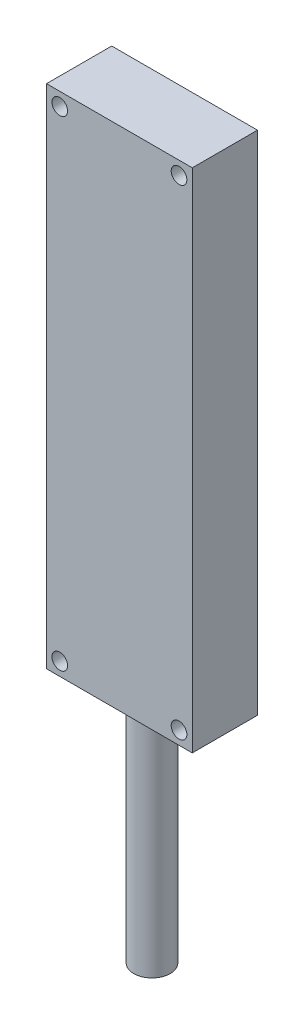
ISO-10303-21;
HEADER;
FILE_DESCRIPTION(('STEP AP214'),'2;1');
FILE_NAME('part.step','',(''),(''),'','','');
FILE_SCHEMA(('AUTOMOTIVE_DESIGN { 1 0 10303 214 1 1 1 1 }'));
ENDSEC;
DATA;
#1=APPLICATION_CONTEXT('core data for automotive mechanical design processes');
#2=APPLICATION_PROTOCOL_DEFINITION('international standard','automotive_design',2000,#1);
#3=PRODUCT_CONTEXT('',#1,'mechanical');
#4=PRODUCT('Part','Part','',(#3));
#5=PRODUCT_RELATED_PRODUCT_CATEGORY('part','',(#4));
#6=PRODUCT_DEFINITION_FORMATION('','',#4);
#7=PRODUCT_DEFINITION_CONTEXT('part definition',#1,'design');
#8=PRODUCT_DEFINITION('design','',#6,#7);
#9=PRODUCT_DEFINITION_SHAPE('','',#8);
#10=(LENGTH_UNIT() NAMED_UNIT(*) SI_UNIT(.MILLI.,.METRE.));
#11=(NAMED_UNIT(*) PLANE_ANGLE_UNIT() SI_UNIT($,.RADIAN.));
#12=(NAMED_UNIT(*) SI_UNIT($,.STERADIAN.) SOLID_ANGLE_UNIT());
#13=UNCERTAINTY_MEASURE_WITH_UNIT(LENGTH_MEASURE(1.E-05),#10,'distance_accuracy_value','');
#14=(GEOMETRIC_REPRESENTATION_CONTEXT(3) GLOBAL_UNCERTAINTY_ASSIGNED_CONTEXT((#13)) GLOBAL_UNIT_ASSIGNED_CONTEXT((#10,
#11,#12)) REPRESENTATION_CONTEXT('',''));
#15=CARTESIAN_POINT('',(0.,0.,0.));
#16=DIRECTION('',(0.,0.,1.));
#17=DIRECTION('',(1.,0.,0.));
#18=AXIS2_PLACEMENT_3D('',#15,#16,#17);
#19=CARTESIAN_POINT('',(-13.97,-48.57,12.5));
#20=DIRECTION('',(1.,0.,0.));
#21=DIRECTION('',(0.,0.,-1.));
#22=AXIS2_PLACEMENT_3D('',#19,#20,#21);
#23=PLANE('',#22);
#24=DIRECTION('',(0.,-1.,0.));
#25=VECTOR('',#24,1.);
#26=CARTESIAN_POINT('',(-13.97,-48.57,0.));
#27=LINE('',#26,#25);
#28=CARTESIAN_POINT('',(-13.97,48.57,0.));
#29=VERTEX_POINT('',#28);
#30=CARTESIAN_POINT('',(-13.97,-48.57,0.));
#31=VERTEX_POINT('',#30);
#32=EDGE_CURVE('E110',#29,#31,#27,.T.);
#33=ORIENTED_EDGE('',*,*,#32,.T.);
#34=DIRECTION('',(0.,0.,-1.));
#35=VECTOR('',#34,1.);
#36=CARTESIAN_POINT('',(-13.97,-48.57,12.5));
#37=LINE('',#36,#35);
#38=CARTESIAN_POINT('',(-13.97,-48.57,12.5));
#39=VERTEX_POINT('',#38);
#40=EDGE_CURVE('E42',#39,#31,#37,.T.);
#41=ORIENTED_EDGE('',*,*,#40,.F.);
#42=DIRECTION('',(0.,-1.,0.));
#43=VECTOR('',#42,1.);
#44=CARTESIAN_POINT('',(-13.97,-48.57,12.5));
#45=LINE('',#44,#43);
#46=CARTESIAN_POINT('',(-13.97,48.57,12.5));
#47=VERTEX_POINT('',#46);
#48=EDGE_CURVE('E93',#47,#39,#45,.T.);
#49=ORIENTED_EDGE('',*,*,#48,.F.);
#50=DIRECTION('',(0.,0.,-1.));
#51=VECTOR('',#50,1.);
#52=CARTESIAN_POINT('',(-13.97,48.57,12.5));
#53=LINE('',#52,#51);
#54=EDGE_CURVE('E106',#47,#29,#53,.T.);
#55=ORIENTED_EDGE('',*,*,#54,.T.);
#56=EDGE_LOOP('',(#33,#41,#49,#55));
#57=FACE_BOUND('',#56,.T.);
#58=ADVANCED_FACE('F39',(#57),#23,.F.);
#59=CARTESIAN_POINT('',(13.97,-48.57,12.5));
#60=DIRECTION('',(0.,1.,0.));
#61=DIRECTION('',(0.,0.,1.));
#62=AXIS2_PLACEMENT_3D('',#59,#60,#61);
#63=PLANE('',#62);
#64=CARTESIAN_POINT('',(0.,-48.57,6.25));
#65=DIRECTION('',(0.,-1.,0.));
#66=DIRECTION('',(0.,0.,-1.));
#67=AXIS2_PLACEMENT_3D('',#64,#65,#66);
#68=CIRCLE('',#67,3.5);
#69=CARTESIAN_POINT('',(0.,-48.57,9.75));
#70=VERTEX_POINT('',#69);
#71=EDGE_CURVE('E11',#70,#70,#68,.T.);
#72=ORIENTED_EDGE('',*,*,#71,.F.);
#73=EDGE_LOOP('',(#72));
#74=FACE_BOUND('',#73,.T.);
#75=DIRECTION('',(1.,0.,0.));
#76=VECTOR('',#75,1.);
#77=CARTESIAN_POINT('',(13.97,-48.57,0.));
#78=LINE('',#77,#76);
#79=CARTESIAN_POINT('',(13.97,-48.57,0.));
#80=VERTEX_POINT('',#79);
#81=EDGE_CURVE('E99',#31,#80,#78,.T.);
#82=ORIENTED_EDGE('',*,*,#81,.T.);
#83=DIRECTION('',(0.,0.,-1.));
#84=VECTOR('',#83,1.);
#85=CARTESIAN_POINT('',(13.97,-48.57,12.5));
#86=LINE('',#85,#84);
#87=CARTESIAN_POINT('',(13.97,-48.57,12.5));
#88=VERTEX_POINT('',#87);
#89=EDGE_CURVE('E97',#88,#80,#86,.T.);
#90=ORIENTED_EDGE('',*,*,#89,.F.);
#91=DIRECTION('',(1.,0.,0.));
#92=VECTOR('',#91,1.);
#93=CARTESIAN_POINT('',(13.97,-48.57,12.5));
#94=LINE('',#93,#92);
#95=EDGE_CURVE('E88',#39,#88,#94,.T.);
#96=ORIENTED_EDGE('',*,*,#95,.F.);
#97=ORIENTED_EDGE('',*,*,#40,.T.);
#98=EDGE_LOOP('',(#82,#90,#96,#97));
#99=FACE_BOUND('',#98,.T.);
#100=ADVANCED_FACE('F98',(#74,#99),#63,.F.);
#101=CARTESIAN_POINT('',(13.97,-48.57,12.5));
#102=DIRECTION('',(-1.,0.,0.));
#103=DIRECTION('',(0.,0.,1.));
#104=AXIS2_PLACEMENT_3D('',#101,#102,#103);
#105=PLANE('',#104);
#106=DIRECTION('',(0.,1.,0.));
#107=VECTOR('',#106,1.);
#108=CARTESIAN_POINT('',(13.97,-48.57,0.));
#109=LINE('',#108,#107);
#110=CARTESIAN_POINT('',(13.97,48.57,0.));
#111=VERTEX_POINT('',#110);
#112=EDGE_CURVE('E74',#80,#111,#109,.T.);
#113=ORIENTED_EDGE('',*,*,#112,.T.);
#114=DIRECTION('',(0.,0.,-1.));
#115=VECTOR('',#114,1.);
#116=CARTESIAN_POINT('',(13.97,48.57,12.5));
#117=LINE('',#116,#115);
#118=CARTESIAN_POINT('',(13.97,48.57,12.5));
#119=VERTEX_POINT('',#118);
#120=EDGE_CURVE('E101',#119,#111,#117,.T.);
#121=ORIENTED_EDGE('',*,*,#120,.F.);
#122=DIRECTION('',(0.,1.,0.));
#123=VECTOR('',#122,1.);
#124=CARTESIAN_POINT('',(13.97,-48.57,12.5));
#125=LINE('',#124,#123);
#126=EDGE_CURVE('E91',#88,#119,#125,.T.);
#127=ORIENTED_EDGE('',*,*,#126,.F.);
#128=ORIENTED_EDGE('',*,*,#89,.T.);
#129=EDGE_LOOP('',(#113,#121,#127,#128));
#130=FACE_BOUND('',#129,.T.);
#131=ADVANCED_FACE('F102',(#130),#105,.F.);
#132=CARTESIAN_POINT('',(13.97,48.57,12.5));
#133=DIRECTION('',(0.,-1.,0.));
#134=DIRECTION('',(1.,0.,0.));
#135=AXIS2_PLACEMENT_3D('',#132,#133,#134);
#136=PLANE('',#135);
#137=DIRECTION('',(-1.,0.,0.));
#138=VECTOR('',#137,1.);
#139=CARTESIAN_POINT('',(13.97,48.57,0.));
#140=LINE('',#139,#138);
#141=EDGE_CURVE('E80',#111,#29,#140,.T.);
#142=ORIENTED_EDGE('',*,*,#141,.T.);
#143=ORIENTED_EDGE('',*,*,#54,.F.);
#144=DIRECTION('',(-1.,0.,0.));
#145=VECTOR('',#144,1.);
#146=CARTESIAN_POINT('',(13.97,48.57,12.5));
#147=LINE('',#146,#145);
#148=EDGE_CURVE('E57',#119,#47,#147,.T.);
#149=ORIENTED_EDGE('',*,*,#148,.F.);
#150=ORIENTED_EDGE('',*,*,#120,.T.);
#151=EDGE_LOOP('',(#142,#143,#149,#150));
#152=FACE_BOUND('',#151,.T.);
#153=ADVANCED_FACE('F124',(#152),#136,.F.);
#154=CARTESIAN_POINT('',(0.,0.,12.5));
#155=DIRECTION('',(0.,0.,1.));
#156=DIRECTION('',(1.,0.,0.));
#157=AXIS2_PLACEMENT_3D('',#154,#155,#156);
#158=PLANE('',#157);
#159=CARTESIAN_POINT('',(11.43,-46.04,12.5));
#160=DIRECTION('',(0.,0.,1.));
#161=DIRECTION('',(1.,0.,0.));
#162=AXIS2_PLACEMENT_3D('',#159,#160,#161);
#163=CIRCLE('',#162,1.5);
#164=CARTESIAN_POINT('',(12.93,-46.04,12.5));
#165=VERTEX_POINT('',#164);
#166=EDGE_CURVE('E114',#165,#165,#163,.T.);
#167=ORIENTED_EDGE('',*,*,#166,.F.);
#168=EDGE_LOOP('',(#167));
#169=FACE_BOUND('',#168,.T.);
#170=CARTESIAN_POINT('',(-11.43,46.04,12.5));
#171=DIRECTION('',(0.,0.,1.));
#172=DIRECTION('',(1.,0.,0.));
#173=AXIS2_PLACEMENT_3D('',#170,#171,#172);
#174=CIRCLE('',#173,1.5);
#175=CARTESIAN_POINT('',(-9.93,46.04,12.5));
#176=VERTEX_POINT('',#175);
#177=EDGE_CURVE('E134',#176,#176,#174,.T.);
#178=ORIENTED_EDGE('',*,*,#177,.F.);
#179=EDGE_LOOP('',(#178));
#180=FACE_BOUND('',#179,.T.);
#181=CARTESIAN_POINT('',(-11.43,-46.04,12.5));
#182=DIRECTION('',(0.,0.,1.));
#183=DIRECTION('',(1.,0.,0.));
#184=AXIS2_PLACEMENT_3D('',#181,#182,#183);
#185=CIRCLE('',#184,1.5);
#186=CARTESIAN_POINT('',(-9.93,-46.04,12.5));
#187=VERTEX_POINT('',#186);
#188=EDGE_CURVE('E138',#187,#187,#185,.T.);
#189=ORIENTED_EDGE('',*,*,#188,.F.);
#190=EDGE_LOOP('',(#189));
#191=FACE_BOUND('',#190,.T.);
#192=CARTESIAN_POINT('',(11.43,46.04,12.5));
#193=DIRECTION('',(0.,0.,1.));
#194=DIRECTION('',(1.,0.,0.));
#195=AXIS2_PLACEMENT_3D('',#192,#193,#194);
#196=CIRCLE('',#195,1.5);
#197=CARTESIAN_POINT('',(12.93,46.04,12.5));
#198=VERTEX_POINT('',#197);
#199=EDGE_CURVE('E142',#198,#198,#196,.T.);
#200=ORIENTED_EDGE('',*,*,#199,.F.);
#201=EDGE_LOOP('',(#200));
#202=FACE_BOUND('',#201,.T.);
#203=ORIENTED_EDGE('',*,*,#48,.T.);
#204=ORIENTED_EDGE('',*,*,#95,.T.);
#205=ORIENTED_EDGE('',*,*,#126,.T.);
#206=ORIENTED_EDGE('',*,*,#148,.T.);
#207=EDGE_LOOP('',(#203,#204,#205,#206));
#208=FACE_BOUND('',#207,.T.);
#209=ADVANCED_FACE('F89',(#169,#180,#191,#202,#208),#158,.T.);
#210=CARTESIAN_POINT('',(0.,0.,0.));
#211=DIRECTION('',(0.,0.,1.));
#212=DIRECTION('',(1.,0.,0.));
#213=AXIS2_PLACEMENT_3D('',#210,#211,#212);
#214=PLANE('',#213);
#215=CARTESIAN_POINT('',(11.43,-46.04,0.));
#216=DIRECTION('',(0.,0.,-1.));
#217=DIRECTION('',(-1.,0.,0.));
#218=AXIS2_PLACEMENT_3D('',#215,#216,#217);
#219=CIRCLE('',#218,1.5);
#220=CARTESIAN_POINT('',(9.93,-46.04,0.));
#221=VERTEX_POINT('',#220);
#222=EDGE_CURVE('E150',#221,#221,#219,.T.);
#223=ORIENTED_EDGE('',*,*,#222,.F.);
#224=EDGE_LOOP('',(#223));
#225=FACE_BOUND('',#224,.T.);
#226=CARTESIAN_POINT('',(-11.43,46.04,0.));
#227=DIRECTION('',(0.,0.,-1.));
#228=DIRECTION('',(-1.,0.,0.));
#229=AXIS2_PLACEMENT_3D('',#226,#227,#228);
#230=CIRCLE('',#229,1.5);
#231=CARTESIAN_POINT('',(-12.93,46.04,0.));
#232=VERTEX_POINT('',#231);
#233=EDGE_CURVE('E151',#232,#232,#230,.T.);
#234=ORIENTED_EDGE('',*,*,#233,.F.);
#235=EDGE_LOOP('',(#234));
#236=FACE_BOUND('',#235,.T.);
#237=CARTESIAN_POINT('',(-11.43,-46.04,0.));
#238=DIRECTION('',(0.,0.,-1.));
#239=DIRECTION('',(-1.,0.,0.));
#240=AXIS2_PLACEMENT_3D('',#237,#238,#239);
#241=CIRCLE('',#240,1.5);
#242=CARTESIAN_POINT('',(-12.93,-46.04,0.));
#243=VERTEX_POINT('',#242);
#244=EDGE_CURVE('E155',#243,#243,#241,.T.);
#245=ORIENTED_EDGE('',*,*,#244,.F.);
#246=EDGE_LOOP('',(#245));
#247=FACE_BOUND('',#246,.T.);
#248=CARTESIAN_POINT('',(11.43,46.04,0.));
#249=DIRECTION('',(0.,0.,-1.));
#250=DIRECTION('',(-1.,0.,0.));
#251=AXIS2_PLACEMENT_3D('',#248,#249,#250);
#252=CIRCLE('',#251,1.5);
#253=CARTESIAN_POINT('',(9.93,46.04,0.));
#254=VERTEX_POINT('',#253);
#255=EDGE_CURVE('E146',#254,#254,#252,.T.);
#256=ORIENTED_EDGE('',*,*,#255,.F.);
#257=EDGE_LOOP('',(#256));
#258=FACE_BOUND('',#257,.T.);
#259=ORIENTED_EDGE('',*,*,#32,.F.);
#260=ORIENTED_EDGE('',*,*,#141,.F.);
#261=ORIENTED_EDGE('',*,*,#112,.F.);
#262=ORIENTED_EDGE('',*,*,#81,.F.);
#263=EDGE_LOOP('',(#259,#260,#261,#262));
#264=FACE_BOUND('',#263,.T.);
#265=ADVANCED_FACE('F127',(#225,#236,#247,#258,#264),#214,.F.);
#266=CARTESIAN_POINT('',(11.43,46.04,23.));
#267=DIRECTION('',(0.,0.,-1.));
#268=DIRECTION('',(-1.,0.,0.));
#269=AXIS2_PLACEMENT_3D('',#266,#267,#268);
#270=CYLINDRICAL_SURFACE('',#269,1.5);
#271=ORIENTED_EDGE('',*,*,#199,.T.);
#272=EDGE_LOOP('',(#271));
#273=FACE_BOUND('',#272,.T.);
#274=ORIENTED_EDGE('',*,*,#255,.T.);
#275=EDGE_LOOP('',(#274));
#276=FACE_BOUND('',#275,.T.);
#277=ADVANCED_FACE('F187',(#273,#276),#270,.F.);
#278=CARTESIAN_POINT('',(-11.43,-46.04,23.));
#279=DIRECTION('',(0.,0.,-1.));
#280=DIRECTION('',(-1.,0.,0.));
#281=AXIS2_PLACEMENT_3D('',#278,#279,#280);
#282=CYLINDRICAL_SURFACE('',#281,1.5);
#283=ORIENTED_EDGE('',*,*,#188,.T.);
#284=EDGE_LOOP('',(#283));
#285=FACE_BOUND('',#284,.T.);
#286=ORIENTED_EDGE('',*,*,#244,.T.);
#287=EDGE_LOOP('',(#286));
#288=FACE_BOUND('',#287,.T.);
#289=ADVANCED_FACE('F194',(#285,#288),#282,.F.);
#290=CARTESIAN_POINT('',(-11.43,46.04,23.));
#291=DIRECTION('',(0.,0.,-1.));
#292=DIRECTION('',(-1.,0.,0.));
#293=AXIS2_PLACEMENT_3D('',#290,#291,#292);
#294=CYLINDRICAL_SURFACE('',#293,1.5);
#295=ORIENTED_EDGE('',*,*,#177,.T.);
#296=EDGE_LOOP('',(#295));
#297=FACE_BOUND('',#296,.T.);
#298=ORIENTED_EDGE('',*,*,#233,.T.);
#299=EDGE_LOOP('',(#298));
#300=FACE_BOUND('',#299,.T.);
#301=ADVANCED_FACE('F196',(#297,#300),#294,.F.);
#302=CARTESIAN_POINT('',(11.43,-46.04,23.));
#303=DIRECTION('',(0.,0.,-1.));
#304=DIRECTION('',(-1.,0.,0.));
#305=AXIS2_PLACEMENT_3D('',#302,#303,#304);
#306=CYLINDRICAL_SURFACE('',#305,1.5);
#307=ORIENTED_EDGE('',*,*,#166,.T.);
#308=EDGE_LOOP('',(#307));
#309=FACE_BOUND('',#308,.T.);
#310=ORIENTED_EDGE('',*,*,#222,.T.);
#311=EDGE_LOOP('',(#310));
#312=FACE_BOUND('',#311,.T.);
#313=ADVANCED_FACE('F172',(#309,#312),#306,.F.);
#314=CARTESIAN_POINT('',(0.,-93.57,6.25));
#315=DIRECTION('',(0.,1.,0.));
#316=DIRECTION('',(0.,0.,1.));
#317=AXIS2_PLACEMENT_3D('',#314,#315,#316);
#318=CYLINDRICAL_SURFACE('',#317,3.5);
#319=CARTESIAN_POINT('',(0.,-93.57,6.25));
#320=DIRECTION('',(0.,-1.,0.));
#321=DIRECTION('',(0.,0.,-1.));
#322=AXIS2_PLACEMENT_3D('',#319,#320,#321);
#323=CIRCLE('',#322,3.5);
#324=CARTESIAN_POINT('',(0.,-93.57,9.75));
#325=VERTEX_POINT('',#324);
#326=EDGE_CURVE('E161',#325,#325,#323,.T.);
#327=CARTESIAN_POINT('',(0.,-93.57,9.75));
#328=CARTESIAN_POINT('',(0.,-93.10125,9.75));
#329=CARTESIAN_POINT('',(0.,-92.6325,9.75));
#330=CARTESIAN_POINT('',(0.,-91.695,9.75));
#331=CARTESIAN_POINT('',(0.,-91.22625,9.75));
#332=CARTESIAN_POINT('',(0.,-90.28875,9.75));
#333=CARTESIAN_POINT('',(0.,-89.82,9.75));
#334=CARTESIAN_POINT('',(0.,-88.8825,9.75));
#335=CARTESIAN_POINT('',(0.,-88.41375,9.75));
#336=CARTESIAN_POINT('',(0.,-87.47625,9.75));
#337=CARTESIAN_POINT('',(0.,-87.0075,9.75));
#338=CARTESIAN_POINT('',(0.,-86.07,9.75));
#339=CARTESIAN_POINT('',(0.,-85.60125,9.75));
#340=CARTESIAN_POINT('',(0.,-84.66375,9.75));
#341=CARTESIAN_POINT('',(0.,-84.195,9.75));
#342=CARTESIAN_POINT('',(0.,-83.2575,9.75));
#343=CARTESIAN_POINT('',(0.,-82.78875,9.75));
#344=CARTESIAN_POINT('',(0.,-81.85125,9.75));
#345=CARTESIAN_POINT('',(0.,-81.3825,9.75));
#346=CARTESIAN_POINT('',(0.,-80.445,9.75));
#347=CARTESIAN_POINT('',(0.,-79.97625,9.75));
#348=CARTESIAN_POINT('',(0.,-79.03875,9.75));
#349=CARTESIAN_POINT('',(0.,-78.57,9.75));
#350=CARTESIAN_POINT('',(0.,-77.6325,9.75));
#351=CARTESIAN_POINT('',(0.,-77.16375,9.75));
#352=CARTESIAN_POINT('',(0.,-76.22625,9.75));
#353=CARTESIAN_POINT('',(0.,-75.7575,9.75));
#354=CARTESIAN_POINT('',(0.,-74.82,9.75));
#355=CARTESIAN_POINT('',(0.,-74.35125,9.75));
#356=CARTESIAN_POINT('',(0.,-73.41375,9.75));
#357=CARTESIAN_POINT('',(0.,-72.945,9.75));
#358=CARTESIAN_POINT('',(0.,-72.0075,9.75));
#359=CARTESIAN_POINT('',(0.,-71.53875,9.75));
#360=CARTESIAN_POINT('',(0.,-70.60125,9.75));
#361=CARTESIAN_POINT('',(0.,-70.1325,9.75));
#362=CARTESIAN_POINT('',(0.,-69.195,9.75));
#363=CARTESIAN_POINT('',(0.,-68.72625,9.75));
#364=CARTESIAN_POINT('',(0.,-67.78875,9.75));
#365=CARTESIAN_POINT('',(0.,-67.32,9.75));
#366=CARTESIAN_POINT('',(0.,-66.3825,9.75));
#367=CARTESIAN_POINT('',(0.,-65.91375,9.75));
#368=CARTESIAN_POINT('',(0.,-64.97625,9.75));
#369=CARTESIAN_POINT('',(0.,-64.5075,9.75));
#370=CARTESIAN_POINT('',(0.,-63.57,9.75));
#371=CARTESIAN_POINT('',(0.,-63.10125,9.75));
#372=CARTESIAN_POINT('',(0.,-62.16375,9.75));
#373=CARTESIAN_POINT('',(0.,-61.695,9.75));
#374=CARTESIAN_POINT('',(0.,-60.7575,9.75));
#375=CARTESIAN_POINT('',(0.,-60.28875,9.75));
#376=CARTESIAN_POINT('',(0.,-59.35125,9.75));
#377=CARTESIAN_POINT('',(0.,-58.8825,9.75));
#378=CARTESIAN_POINT('',(0.,-57.945,9.75));
#379=CARTESIAN_POINT('',(0.,-57.47625,9.75));
#380=CARTESIAN_POINT('',(0.,-56.53875,9.75));
#381=CARTESIAN_POINT('',(0.,-56.07,9.75));
#382=CARTESIAN_POINT('',(0.,-55.1325,9.75));
#383=CARTESIAN_POINT('',(0.,-54.66375,9.75));
#384=CARTESIAN_POINT('',(0.,-53.72625,9.75));
#385=CARTESIAN_POINT('',(0.,-53.2575,9.75));
#386=CARTESIAN_POINT('',(0.,-52.32,9.75));
#387=CARTESIAN_POINT('',(0.,-51.85125,9.75));
#388=CARTESIAN_POINT('',(0.,-50.91375,9.75));
#389=CARTESIAN_POINT('',(0.,-50.445,9.75));
#390=CARTESIAN_POINT('',(0.,-49.5075,9.75));
#391=CARTESIAN_POINT('',(0.,-49.03875,9.75));
#392=CARTESIAN_POINT('',(0.,-48.57,9.75));
#393=B_SPLINE_CURVE_WITH_KNOTS('',3,(#327,#328,#329,#330,#331,#332,#333,#334,#335,#336,#337,
#338,#339,#340,#341,#342,#343,#344,#345,#346,#347,#348,#349,#350,#351,#352,#353,#354,#355,#356,
#357,#358,#359,#360,#361,#362,#363,#364,#365,#366,#367,#368,#369,#370,#371,#372,#373,#374,#375,
#376,#377,#378,#379,#380,#381,#382,#383,#384,#385,#386,#387,#388,#389,#390,#391,#392),
.UNSPECIFIED.,.F.,.F.,(4,2,2,2,2,2,2,2,2,2,2,2,2,2,2,2,2,2,2,2,2,2,2,2,2,2,2,2,2,2,2,2,4),(0.,
1.40625,2.8125,4.21874999999999,5.62499999999999,7.03124999999999,8.43749999999999,
9.84374999999998,11.25,12.65625,14.0625,15.46875,16.875,18.28125,19.6875,21.09375,22.5,23.90625,
25.3125,26.71875,28.125,29.53125,30.9375,32.34375,33.75,35.15625,36.5625,37.96875,39.375,
40.78125,42.1875,43.59375,45.),.UNSPECIFIED.);
#394=EDGE_CURVE('BSEAM169',#325,#70,#393,.T.);
#395=ORIENTED_EDGE('',*,*,#326,.F.);
#396=ORIENTED_EDGE('',*,*,#71,.T.);
#397=ORIENTED_EDGE('',*,*,#394,.T.);
#398=ORIENTED_EDGE('',*,*,#394,.F.);
#399=EDGE_LOOP('',(#395,#397,#396,#398));
#400=FACE_BOUND('',#399,.T.);
#401=ADVANCED_FACE('F169',(#400),#318,.T.);
#402=CARTESIAN_POINT('',(0.,-93.57,6.25));
#403=DIRECTION('',(0.,-1.,0.));
#404=DIRECTION('',(0.,0.,-1.));
#405=AXIS2_PLACEMENT_3D('',#402,#403,#404);
#406=PLANE('',#405);
#407=ORIENTED_EDGE('',*,*,#326,.T.);
#408=EDGE_LOOP('',(#407));
#409=FACE_BOUND('',#408,.T.);
#410=ADVANCED_FACE('F167',(#409),#406,.T.);
#411=CLOSED_SHELL('',(#58,#100,#131,#153,#209,#265,#277,#289,#301,#313,#401,#410));
#412=MANIFOLD_SOLID_BREP('B2',#411);
#413=ADVANCED_BREP_SHAPE_REPRESENTATION('',(#18,#412),#14);
#414=SHAPE_DEFINITION_REPRESENTATION(#9,#413);
ENDSEC;
END-ISO-10303-21;
